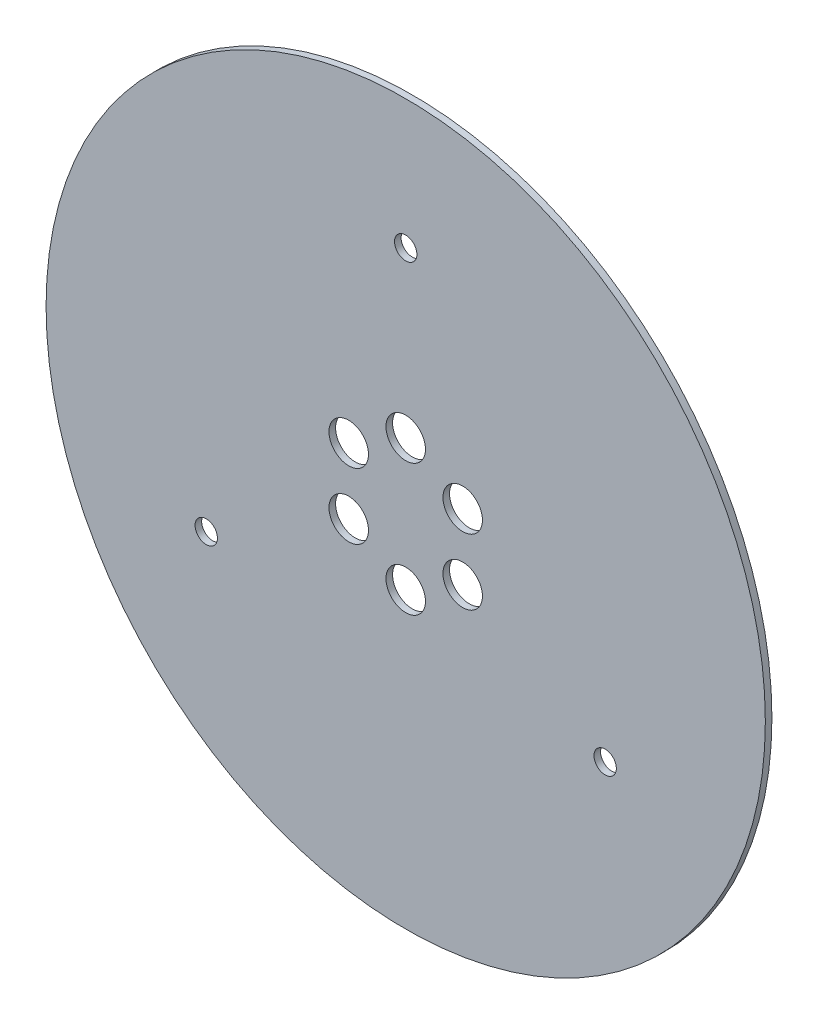
ISO-10303-21;
HEADER;
FILE_DESCRIPTION(('STEP AP214'),'2;1');
FILE_NAME('part.step','',(''),(''),'','','');
FILE_SCHEMA(('AUTOMOTIVE_DESIGN { 1 0 10303 214 1 1 1 1 }'));
ENDSEC;
DATA;
#1=APPLICATION_CONTEXT('core data for automotive mechanical design processes');
#2=APPLICATION_PROTOCOL_DEFINITION('international standard','automotive_design',2000,#1);
#3=PRODUCT_CONTEXT('',#1,'mechanical');
#4=PRODUCT('Part','Part','',(#3));
#5=PRODUCT_RELATED_PRODUCT_CATEGORY('part','',(#4));
#6=PRODUCT_DEFINITION_FORMATION('','',#4);
#7=PRODUCT_DEFINITION_CONTEXT('part definition',#1,'design');
#8=PRODUCT_DEFINITION('design','',#6,#7);
#9=PRODUCT_DEFINITION_SHAPE('','',#8);
#10=(LENGTH_UNIT() NAMED_UNIT(*) SI_UNIT(.MILLI.,.METRE.));
#11=(NAMED_UNIT(*) PLANE_ANGLE_UNIT() SI_UNIT($,.RADIAN.));
#12=(NAMED_UNIT(*) SI_UNIT($,.STERADIAN.) SOLID_ANGLE_UNIT());
#13=UNCERTAINTY_MEASURE_WITH_UNIT(LENGTH_MEASURE(1.E-05),#10,'distance_accuracy_value','');
#14=(GEOMETRIC_REPRESENTATION_CONTEXT(3) GLOBAL_UNCERTAINTY_ASSIGNED_CONTEXT((#13)) GLOBAL_UNIT_ASSIGNED_CONTEXT((#10,
#11,#12)) REPRESENTATION_CONTEXT('',''));
#15=CARTESIAN_POINT('',(0.,0.,0.));
#16=DIRECTION('',(0.,0.,1.));
#17=DIRECTION('',(1.,0.,0.));
#18=AXIS2_PLACEMENT_3D('',#15,#16,#17);
#19=CARTESIAN_POINT('',(8.50201989313826E-13,0.,1.));
#20=DIRECTION('',(0.,0.,1.));
#21=DIRECTION('',(1.,0.,0.));
#22=AXIS2_PLACEMENT_3D('',#19,#20,#21);
#23=PLANE('',#22);
#24=CARTESIAN_POINT('',(-8.66025403784438,-5.,1.));
#25=DIRECTION('',(0.,0.,1.));
#26=DIRECTION('',(1.,0.,0.));
#27=AXIS2_PLACEMENT_3D('',#24,#25,#26);
#28=CIRCLE('',#27,3.);
#29=CARTESIAN_POINT('',(-5.66025403784438,-5.,1.));
#30=VERTEX_POINT('',#29);
#31=EDGE_CURVE('E83',#30,#30,#28,.T.);
#32=ORIENTED_EDGE('',*,*,#31,.F.);
#33=EDGE_LOOP('',(#32));
#34=FACE_BOUND('',#33,.T.);
#35=CARTESIAN_POINT('',(8.66025403784439,-5.,1.));
#36=DIRECTION('',(0.,0.,1.));
#37=DIRECTION('',(1.,0.,0.));
#38=AXIS2_PLACEMENT_3D('',#35,#36,#37);
#39=CIRCLE('',#38,3.);
#40=CARTESIAN_POINT('',(11.6602540378444,-5.,1.));
#41=VERTEX_POINT('',#40);
#42=EDGE_CURVE('E71',#41,#41,#39,.T.);
#43=ORIENTED_EDGE('',*,*,#42,.F.);
#44=EDGE_LOOP('',(#43));
#45=FACE_BOUND('',#44,.T.);
#46=CARTESIAN_POINT('',(-30.3108891324554,-17.5,1.));
#47=DIRECTION('',(0.,0.,1.));
#48=DIRECTION('',(1.,0.,0.));
#49=AXIS2_PLACEMENT_3D('',#46,#47,#48);
#50=CIRCLE('',#49,1.7);
#51=CARTESIAN_POINT('',(-28.6108891324553,-17.5,1.));
#52=VERTEX_POINT('',#51);
#53=EDGE_CURVE('E59',#52,#52,#50,.T.);
#54=ORIENTED_EDGE('',*,*,#53,.F.);
#55=EDGE_LOOP('',(#54));
#56=FACE_BOUND('',#55,.T.);
#57=CARTESIAN_POINT('',(0.,10.,1.));
#58=DIRECTION('',(0.,0.,1.));
#59=DIRECTION('',(1.,0.,0.));
#60=AXIS2_PLACEMENT_3D('',#57,#58,#59);
#61=CIRCLE('',#60,3.);
#62=CARTESIAN_POINT('',(3.,10.,1.));
#63=VERTEX_POINT('',#62);
#64=EDGE_CURVE('E47',#63,#63,#61,.T.);
#65=ORIENTED_EDGE('',*,*,#64,.F.);
#66=EDGE_LOOP('',(#65));
#67=FACE_BOUND('',#66,.T.);
#68=CARTESIAN_POINT('',(8.50201989313826E-13,0.,1.));
#69=DIRECTION('',(0.,0.,1.));
#70=DIRECTION('',(1.,0.,0.));
#71=AXIS2_PLACEMENT_3D('',#68,#69,#70);
#72=CIRCLE('',#71,54.6563422446705);
#73=CARTESIAN_POINT('',(54.6563422446714,0.,1.));
#74=VERTEX_POINT('',#73);
#75=EDGE_CURVE('E10',#74,#74,#72,.T.);
#76=ORIENTED_EDGE('',*,*,#75,.T.);
#77=EDGE_LOOP('',(#76));
#78=FACE_BOUND('',#77,.T.);
#79=CARTESIAN_POINT('',(0.,35.,1.));
#80=DIRECTION('',(0.,0.,1.));
#81=DIRECTION('',(1.,0.,0.));
#82=AXIS2_PLACEMENT_3D('',#79,#80,#81);
#83=CIRCLE('',#82,1.7);
#84=CARTESIAN_POINT('',(1.7,35.,1.));
#85=VERTEX_POINT('',#84);
#86=EDGE_CURVE('E42',#85,#85,#83,.T.);
#87=ORIENTED_EDGE('',*,*,#86,.F.);
#88=EDGE_LOOP('',(#87));
#89=FACE_BOUND('',#88,.T.);
#90=CARTESIAN_POINT('',(30.3108891324554,-17.5,1.));
#91=DIRECTION('',(0.,0.,1.));
#92=DIRECTION('',(1.,0.,0.));
#93=AXIS2_PLACEMENT_3D('',#90,#91,#92);
#94=CIRCLE('',#93,1.7);
#95=CARTESIAN_POINT('',(32.0108891324554,-17.5,1.));
#96=VERTEX_POINT('',#95);
#97=EDGE_CURVE('E53',#96,#96,#94,.T.);
#98=ORIENTED_EDGE('',*,*,#97,.F.);
#99=EDGE_LOOP('',(#98));
#100=FACE_BOUND('',#99,.T.);
#101=CARTESIAN_POINT('',(8.66025403784439,5.,1.));
#102=DIRECTION('',(0.,0.,1.));
#103=DIRECTION('',(1.,0.,0.));
#104=AXIS2_PLACEMENT_3D('',#101,#102,#103);
#105=CIRCLE('',#104,3.);
#106=CARTESIAN_POINT('',(11.6602540378444,5.,1.));
#107=VERTEX_POINT('',#106);
#108=EDGE_CURVE('E65',#107,#107,#105,.T.);
#109=ORIENTED_EDGE('',*,*,#108,.F.);
#110=EDGE_LOOP('',(#109));
#111=FACE_BOUND('',#110,.T.);
#112=CARTESIAN_POINT('',(0.,-10.,1.));
#113=DIRECTION('',(0.,0.,1.));
#114=DIRECTION('',(1.,0.,0.));
#115=AXIS2_PLACEMENT_3D('',#112,#113,#114);
#116=CIRCLE('',#115,3.);
#117=CARTESIAN_POINT('',(3.,-10.,1.));
#118=VERTEX_POINT('',#117);
#119=EDGE_CURVE('E77',#118,#118,#116,.T.);
#120=ORIENTED_EDGE('',*,*,#119,.F.);
#121=EDGE_LOOP('',(#120));
#122=FACE_BOUND('',#121,.T.);
#123=CARTESIAN_POINT('',(-8.66025403784439,4.99999999999999,1.));
#124=DIRECTION('',(0.,0.,1.));
#125=DIRECTION('',(1.,0.,0.));
#126=AXIS2_PLACEMENT_3D('',#123,#124,#125);
#127=CIRCLE('',#126,3.);
#128=CARTESIAN_POINT('',(-5.66025403784439,4.99999999999999,1.));
#129=VERTEX_POINT('',#128);
#130=EDGE_CURVE('E89',#129,#129,#127,.T.);
#131=ORIENTED_EDGE('',*,*,#130,.F.);
#132=EDGE_LOOP('',(#131));
#133=FACE_BOUND('',#132,.T.);
#134=ADVANCED_FACE('F31',(#34,#45,#56,#67,#78,#89,#100,#111,#122,#133),#23,.T.);
#135=CARTESIAN_POINT('',(8.50201989313826E-13,0.,0.));
#136=DIRECTION('',(0.,0.,1.));
#137=DIRECTION('',(1.,0.,0.));
#138=AXIS2_PLACEMENT_3D('',#135,#136,#137);
#139=PLANE('',#138);
#140=CARTESIAN_POINT('',(8.50201989313826E-13,0.,0.));
#141=DIRECTION('',(0.,0.,1.));
#142=DIRECTION('',(1.,0.,0.));
#143=AXIS2_PLACEMENT_3D('',#140,#141,#142);
#144=CIRCLE('',#143,54.6563422446705);
#145=CARTESIAN_POINT('',(54.6563422446714,0.,0.));
#146=VERTEX_POINT('',#145);
#147=EDGE_CURVE('E35',#146,#146,#144,.T.);
#148=ORIENTED_EDGE('',*,*,#147,.F.);
#149=EDGE_LOOP('',(#148));
#150=FACE_BOUND('',#149,.T.);
#151=CARTESIAN_POINT('',(0.,35.,0.));
#152=DIRECTION('',(0.,0.,1.));
#153=DIRECTION('',(1.,0.,0.));
#154=AXIS2_PLACEMENT_3D('',#151,#152,#153);
#155=CIRCLE('',#154,1.7);
#156=CARTESIAN_POINT('',(1.7,35.,0.));
#157=VERTEX_POINT('',#156);
#158=EDGE_CURVE('E44',#157,#157,#155,.T.);
#159=ORIENTED_EDGE('',*,*,#158,.T.);
#160=EDGE_LOOP('',(#159));
#161=FACE_BOUND('',#160,.T.);
#162=CARTESIAN_POINT('',(0.,10.,0.));
#163=DIRECTION('',(0.,0.,1.));
#164=DIRECTION('',(1.,0.,0.));
#165=AXIS2_PLACEMENT_3D('',#162,#163,#164);
#166=CIRCLE('',#165,3.);
#167=CARTESIAN_POINT('',(3.,10.,0.));
#168=VERTEX_POINT('',#167);
#169=EDGE_CURVE('E50',#168,#168,#166,.T.);
#170=ORIENTED_EDGE('',*,*,#169,.T.);
#171=EDGE_LOOP('',(#170));
#172=FACE_BOUND('',#171,.T.);
#173=CARTESIAN_POINT('',(30.3108891324554,-17.5,0.));
#174=DIRECTION('',(0.,0.,1.));
#175=DIRECTION('',(1.,0.,0.));
#176=AXIS2_PLACEMENT_3D('',#173,#174,#175);
#177=CIRCLE('',#176,1.7);
#178=CARTESIAN_POINT('',(32.0108891324554,-17.5,0.));
#179=VERTEX_POINT('',#178);
#180=EDGE_CURVE('E56',#179,#179,#177,.T.);
#181=ORIENTED_EDGE('',*,*,#180,.T.);
#182=EDGE_LOOP('',(#181));
#183=FACE_BOUND('',#182,.T.);
#184=CARTESIAN_POINT('',(-30.3108891324554,-17.5,0.));
#185=DIRECTION('',(0.,0.,1.));
#186=DIRECTION('',(1.,0.,0.));
#187=AXIS2_PLACEMENT_3D('',#184,#185,#186);
#188=CIRCLE('',#187,1.7);
#189=CARTESIAN_POINT('',(-28.6108891324553,-17.5,0.));
#190=VERTEX_POINT('',#189);
#191=EDGE_CURVE('E62',#190,#190,#188,.T.);
#192=ORIENTED_EDGE('',*,*,#191,.T.);
#193=EDGE_LOOP('',(#192));
#194=FACE_BOUND('',#193,.T.);
#195=CARTESIAN_POINT('',(8.66025403784439,5.,0.));
#196=DIRECTION('',(0.,0.,1.));
#197=DIRECTION('',(1.,0.,0.));
#198=AXIS2_PLACEMENT_3D('',#195,#196,#197);
#199=CIRCLE('',#198,3.);
#200=CARTESIAN_POINT('',(11.6602540378444,5.,0.));
#201=VERTEX_POINT('',#200);
#202=EDGE_CURVE('E68',#201,#201,#199,.T.);
#203=ORIENTED_EDGE('',*,*,#202,.T.);
#204=EDGE_LOOP('',(#203));
#205=FACE_BOUND('',#204,.T.);
#206=CARTESIAN_POINT('',(8.66025403784439,-5.,0.));
#207=DIRECTION('',(0.,0.,1.));
#208=DIRECTION('',(1.,0.,0.));
#209=AXIS2_PLACEMENT_3D('',#206,#207,#208);
#210=CIRCLE('',#209,3.);
#211=CARTESIAN_POINT('',(11.6602540378444,-5.,0.));
#212=VERTEX_POINT('',#211);
#213=EDGE_CURVE('E74',#212,#212,#210,.T.);
#214=ORIENTED_EDGE('',*,*,#213,.T.);
#215=EDGE_LOOP('',(#214));
#216=FACE_BOUND('',#215,.T.);
#217=CARTESIAN_POINT('',(0.,-10.,0.));
#218=DIRECTION('',(0.,0.,1.));
#219=DIRECTION('',(1.,0.,0.));
#220=AXIS2_PLACEMENT_3D('',#217,#218,#219);
#221=CIRCLE('',#220,3.);
#222=CARTESIAN_POINT('',(3.,-10.,0.));
#223=VERTEX_POINT('',#222);
#224=EDGE_CURVE('E80',#223,#223,#221,.T.);
#225=ORIENTED_EDGE('',*,*,#224,.T.);
#226=EDGE_LOOP('',(#225));
#227=FACE_BOUND('',#226,.T.);
#228=CARTESIAN_POINT('',(-8.66025403784438,-5.,0.));
#229=DIRECTION('',(0.,0.,1.));
#230=DIRECTION('',(1.,0.,0.));
#231=AXIS2_PLACEMENT_3D('',#228,#229,#230);
#232=CIRCLE('',#231,3.);
#233=CARTESIAN_POINT('',(-5.66025403784438,-5.,0.));
#234=VERTEX_POINT('',#233);
#235=EDGE_CURVE('E86',#234,#234,#232,.T.);
#236=ORIENTED_EDGE('',*,*,#235,.T.);
#237=EDGE_LOOP('',(#236));
#238=FACE_BOUND('',#237,.T.);
#239=CARTESIAN_POINT('',(-8.66025403784439,4.99999999999999,0.));
#240=DIRECTION('',(0.,0.,1.));
#241=DIRECTION('',(1.,0.,0.));
#242=AXIS2_PLACEMENT_3D('',#239,#240,#241);
#243=CIRCLE('',#242,3.);
#244=CARTESIAN_POINT('',(-5.66025403784439,4.99999999999999,0.));
#245=VERTEX_POINT('',#244);
#246=EDGE_CURVE('E92',#245,#245,#243,.T.);
#247=ORIENTED_EDGE('',*,*,#246,.T.);
#248=EDGE_LOOP('',(#247));
#249=FACE_BOUND('',#248,.T.);
#250=ADVANCED_FACE('F102',(#150,#161,#172,#183,#194,#205,#216,#227,#238,#249),#139,.F.);
#251=CARTESIAN_POINT('',(8.50201989313826E-13,0.,1.));
#252=DIRECTION('',(0.,0.,-1.));
#253=DIRECTION('',(-1.,0.,0.));
#254=AXIS2_PLACEMENT_3D('',#251,#252,#253);
#255=CYLINDRICAL_SURFACE('',#254,54.6563422446705);
#256=ORIENTED_EDGE('',*,*,#75,.F.);
#257=EDGE_LOOP('',(#256));
#258=FACE_BOUND('',#257,.T.);
#259=ORIENTED_EDGE('',*,*,#147,.T.);
#260=EDGE_LOOP('',(#259));
#261=FACE_BOUND('',#260,.T.);
#262=ADVANCED_FACE('F33',(#258,#261),#255,.T.);
#263=CARTESIAN_POINT('',(0.,35.,1.));
#264=DIRECTION('',(0.,0.,-1.));
#265=DIRECTION('',(-1.,0.,0.));
#266=AXIS2_PLACEMENT_3D('',#263,#264,#265);
#267=CYLINDRICAL_SURFACE('',#266,1.7);
#268=ORIENTED_EDGE('',*,*,#86,.T.);
#269=EDGE_LOOP('',(#268));
#270=FACE_BOUND('',#269,.T.);
#271=ORIENTED_EDGE('',*,*,#158,.F.);
#272=EDGE_LOOP('',(#271));
#273=FACE_BOUND('',#272,.T.);
#274=ADVANCED_FACE('F112',(#270,#273),#267,.F.);
#275=CARTESIAN_POINT('',(0.,10.,1.));
#276=DIRECTION('',(0.,0.,-1.));
#277=DIRECTION('',(-1.,0.,0.));
#278=AXIS2_PLACEMENT_3D('',#275,#276,#277);
#279=CYLINDRICAL_SURFACE('',#278,3.);
#280=ORIENTED_EDGE('',*,*,#64,.T.);
#281=EDGE_LOOP('',(#280));
#282=FACE_BOUND('',#281,.T.);
#283=ORIENTED_EDGE('',*,*,#169,.F.);
#284=EDGE_LOOP('',(#283));
#285=FACE_BOUND('',#284,.T.);
#286=ADVANCED_FACE('F115',(#282,#285),#279,.F.);
#287=CARTESIAN_POINT('',(30.3108891324554,-17.5,1.));
#288=DIRECTION('',(0.,0.,-1.));
#289=DIRECTION('',(-1.,0.,0.));
#290=AXIS2_PLACEMENT_3D('',#287,#288,#289);
#291=CYLINDRICAL_SURFACE('',#290,1.7);
#292=ORIENTED_EDGE('',*,*,#97,.T.);
#293=EDGE_LOOP('',(#292));
#294=FACE_BOUND('',#293,.T.);
#295=ORIENTED_EDGE('',*,*,#180,.F.);
#296=EDGE_LOOP('',(#295));
#297=FACE_BOUND('',#296,.T.);
#298=ADVANCED_FACE('F119',(#294,#297),#291,.F.);
#299=CARTESIAN_POINT('',(-30.3108891324554,-17.5,1.));
#300=DIRECTION('',(0.,0.,-1.));
#301=DIRECTION('',(-1.,0.,0.));
#302=AXIS2_PLACEMENT_3D('',#299,#300,#301);
#303=CYLINDRICAL_SURFACE('',#302,1.7);
#304=ORIENTED_EDGE('',*,*,#53,.T.);
#305=EDGE_LOOP('',(#304));
#306=FACE_BOUND('',#305,.T.);
#307=ORIENTED_EDGE('',*,*,#191,.F.);
#308=EDGE_LOOP('',(#307));
#309=FACE_BOUND('',#308,.T.);
#310=ADVANCED_FACE('F123',(#306,#309),#303,.F.);
#311=CARTESIAN_POINT('',(8.66025403784439,5.,1.));
#312=DIRECTION('',(0.,0.,-1.));
#313=DIRECTION('',(-1.,0.,0.));
#314=AXIS2_PLACEMENT_3D('',#311,#312,#313);
#315=CYLINDRICAL_SURFACE('',#314,3.);
#316=ORIENTED_EDGE('',*,*,#108,.T.);
#317=EDGE_LOOP('',(#316));
#318=FACE_BOUND('',#317,.T.);
#319=ORIENTED_EDGE('',*,*,#202,.F.);
#320=EDGE_LOOP('',(#319));
#321=FACE_BOUND('',#320,.T.);
#322=ADVANCED_FACE('F127',(#318,#321),#315,.F.);
#323=CARTESIAN_POINT('',(8.66025403784439,-5.,1.));
#324=DIRECTION('',(0.,0.,-1.));
#325=DIRECTION('',(-1.,0.,0.));
#326=AXIS2_PLACEMENT_3D('',#323,#324,#325);
#327=CYLINDRICAL_SURFACE('',#326,3.);
#328=ORIENTED_EDGE('',*,*,#42,.T.);
#329=EDGE_LOOP('',(#328));
#330=FACE_BOUND('',#329,.T.);
#331=ORIENTED_EDGE('',*,*,#213,.F.);
#332=EDGE_LOOP('',(#331));
#333=FACE_BOUND('',#332,.T.);
#334=ADVANCED_FACE('F131',(#330,#333),#327,.F.);
#335=CARTESIAN_POINT('',(0.,-10.,1.));
#336=DIRECTION('',(0.,0.,-1.));
#337=DIRECTION('',(-1.,0.,0.));
#338=AXIS2_PLACEMENT_3D('',#335,#336,#337);
#339=CYLINDRICAL_SURFACE('',#338,3.);
#340=ORIENTED_EDGE('',*,*,#119,.T.);
#341=EDGE_LOOP('',(#340));
#342=FACE_BOUND('',#341,.T.);
#343=ORIENTED_EDGE('',*,*,#224,.F.);
#344=EDGE_LOOP('',(#343));
#345=FACE_BOUND('',#344,.T.);
#346=ADVANCED_FACE('F135',(#342,#345),#339,.F.);
#347=CARTESIAN_POINT('',(-8.66025403784438,-5.,1.));
#348=DIRECTION('',(0.,0.,-1.));
#349=DIRECTION('',(-1.,0.,0.));
#350=AXIS2_PLACEMENT_3D('',#347,#348,#349);
#351=CYLINDRICAL_SURFACE('',#350,3.);
#352=ORIENTED_EDGE('',*,*,#31,.T.);
#353=EDGE_LOOP('',(#352));
#354=FACE_BOUND('',#353,.T.);
#355=ORIENTED_EDGE('',*,*,#235,.F.);
#356=EDGE_LOOP('',(#355));
#357=FACE_BOUND('',#356,.T.);
#358=ADVANCED_FACE('F139',(#354,#357),#351,.F.);
#359=CARTESIAN_POINT('',(-8.66025403784439,4.99999999999999,1.));
#360=DIRECTION('',(0.,0.,-1.));
#361=DIRECTION('',(-1.,0.,0.));
#362=AXIS2_PLACEMENT_3D('',#359,#360,#361);
#363=CYLINDRICAL_SURFACE('',#362,3.);
#364=ORIENTED_EDGE('',*,*,#130,.T.);
#365=EDGE_LOOP('',(#364));
#366=FACE_BOUND('',#365,.T.);
#367=ORIENTED_EDGE('',*,*,#246,.F.);
#368=EDGE_LOOP('',(#367));
#369=FACE_BOUND('',#368,.T.);
#370=ADVANCED_FACE('F98',(#366,#369),#363,.F.);
#371=CLOSED_SHELL('',(#134,#250,#262,#274,#286,#298,#310,#322,#334,#346,#358,#370));
#372=MANIFOLD_SOLID_BREP('B2',#371);
#373=ADVANCED_BREP_SHAPE_REPRESENTATION('',(#18,#372),#14);
#374=SHAPE_DEFINITION_REPRESENTATION(#9,#373);
ENDSEC;
END-ISO-10303-21;
